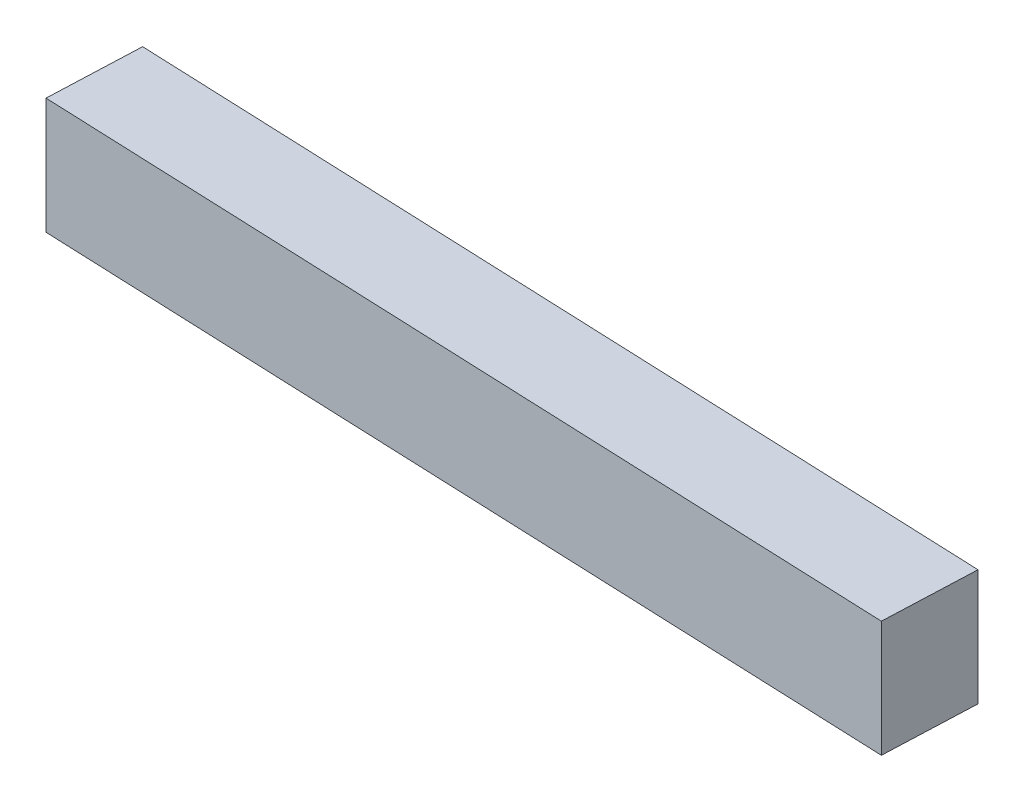
ISO-10303-21;
HEADER;
FILE_DESCRIPTION(('STEP AP214'),'2;1');
FILE_NAME('part.step','',(''),(''),'','','');
FILE_SCHEMA(('AUTOMOTIVE_DESIGN { 1 0 10303 214 1 1 1 1 }'));
ENDSEC;
DATA;
#1=APPLICATION_CONTEXT('core data for automotive mechanical design processes');
#2=APPLICATION_PROTOCOL_DEFINITION('international standard','automotive_design',2000,#1);
#3=PRODUCT_CONTEXT('',#1,'mechanical');
#4=PRODUCT('Part','Part','',(#3));
#5=PRODUCT_RELATED_PRODUCT_CATEGORY('part','',(#4));
#6=PRODUCT_DEFINITION_FORMATION('','',#4);
#7=PRODUCT_DEFINITION_CONTEXT('part definition',#1,'design');
#8=PRODUCT_DEFINITION('design','',#6,#7);
#9=PRODUCT_DEFINITION_SHAPE('','',#8);
#10=(LENGTH_UNIT() NAMED_UNIT(*) SI_UNIT(.MILLI.,.METRE.));
#11=(NAMED_UNIT(*) PLANE_ANGLE_UNIT() SI_UNIT($,.RADIAN.));
#12=(NAMED_UNIT(*) SI_UNIT($,.STERADIAN.) SOLID_ANGLE_UNIT());
#13=UNCERTAINTY_MEASURE_WITH_UNIT(LENGTH_MEASURE(1.E-05),#10,'distance_accuracy_value','');
#14=(GEOMETRIC_REPRESENTATION_CONTEXT(3) GLOBAL_UNCERTAINTY_ASSIGNED_CONTEXT((#13)) GLOBAL_UNIT_ASSIGNED_CONTEXT((#10,
#11,#12)) REPRESENTATION_CONTEXT('',''));
#15=CARTESIAN_POINT('',(0.,0.,0.));
#16=DIRECTION('',(0.,0.,1.));
#17=DIRECTION('',(1.,0.,0.));
#18=AXIS2_PLACEMENT_3D('',#15,#16,#17);
#19=CARTESIAN_POINT('',(17.987452214843,7.874,0.62875382098005));
#20=DIRECTION('',(-0.040515452667737,0.,0.999178911954775));
#21=DIRECTION('',(0.999178911954775,0.,0.040515452667737));
#22=AXIS2_PLACEMENT_3D('',#19,#20,#21);
#23=PLANE('',#22);
#24=DIRECTION('',(0.,1.,0.));
#25=VECTOR('',#24,1.);
#26=CARTESIAN_POINT('',(17.987452214843,7.874,0.62875382098005));
#27=LINE('',#26,#25);
#28=CARTESIAN_POINT('',(17.987452214843,7.62,0.62875382098005));
#29=VERTEX_POINT('',#28);
#30=CARTESIAN_POINT('',(17.987452214843,7.874,0.62875382098005));
#31=VERTEX_POINT('',#30);
#32=EDGE_CURVE('E20',#29,#31,#27,.T.);
#33=ORIENTED_EDGE('',*,*,#32,.T.);
#34=DIRECTION('',(-0.999178911954775,0.,-0.0405154526677359));
#35=VECTOR('',#34,1.);
#36=CARTESIAN_POINT('',(19.8908880421169,7.874,0.705935758312089));
#37=LINE('',#36,#35);
#38=CARTESIAN_POINT('',(19.8908880421169,7.874,0.705935758312089));
#39=VERTEX_POINT('',#38);
#40=EDGE_CURVE('E55',#39,#31,#37,.T.);
#41=ORIENTED_EDGE('',*,*,#40,.F.);
#42=DIRECTION('',(0.,1.,0.));
#43=VECTOR('',#42,1.);
#44=CARTESIAN_POINT('',(19.8908880421169,7.874,0.705935758312089));
#45=LINE('',#44,#43);
#46=CARTESIAN_POINT('',(19.8908880421169,7.62,0.70593575831209));
#47=VERTEX_POINT('',#46);
#48=EDGE_CURVE('E76',#39,#47,#45,.F.);
#49=ORIENTED_EDGE('',*,*,#48,.T.);
#50=DIRECTION('',(-0.999178911954775,0.,-0.0405154526677359));
#51=VECTOR('',#50,1.);
#52=CARTESIAN_POINT('',(19.8908880421169,7.62,0.705935758312089));
#53=LINE('',#52,#51);
#54=EDGE_CURVE('E58',#47,#29,#53,.T.);
#55=ORIENTED_EDGE('',*,*,#54,.T.);
#56=EDGE_LOOP('',(#33,#41,#49,#55));
#57=FACE_BOUND('',#56,.T.);
#58=ADVANCED_FACE('F17',(#57),#23,.F.);
#59=CARTESIAN_POINT('',(17.987452214843,7.874,0.62875382098005));
#60=DIRECTION('',(0.999178911954776,0.,0.0405154526677127));
#61=DIRECTION('',(0.0405154526677127,0.,-0.999178911954776));
#62=AXIS2_PLACEMENT_3D('',#59,#60,#61);
#63=PLANE('',#62);
#64=DIRECTION('',(0.,1.,0.));
#65=VECTOR('',#64,1.);
#66=CARTESIAN_POINT('',(17.9792194748609,7.874,0.831786975889266));
#67=LINE('',#66,#65);
#68=CARTESIAN_POINT('',(17.9792194748609,7.62,0.831786975889266));
#69=VERTEX_POINT('',#68);
#70=CARTESIAN_POINT('',(17.9792194748609,7.874,0.831786975889266));
#71=VERTEX_POINT('',#70);
#72=EDGE_CURVE('E73',#69,#71,#67,.T.);
#73=ORIENTED_EDGE('',*,*,#72,.T.);
#74=DIRECTION('',(-0.040515452667798,0.,0.999178911954773));
#75=VECTOR('',#74,1.);
#76=CARTESIAN_POINT('',(17.987452214843,7.874,0.62875382098005));
#77=LINE('',#76,#75);
#78=EDGE_CURVE('E63',#31,#71,#77,.T.);
#79=ORIENTED_EDGE('',*,*,#78,.F.);
#80=ORIENTED_EDGE('',*,*,#32,.F.);
#81=DIRECTION('',(-0.040515452667798,0.,0.999178911954773));
#82=VECTOR('',#81,1.);
#83=CARTESIAN_POINT('',(17.987452214843,7.62,0.62875382098005));
#84=LINE('',#83,#82);
#85=EDGE_CURVE('E80',#29,#69,#84,.T.);
#86=ORIENTED_EDGE('',*,*,#85,.T.);
#87=EDGE_LOOP('',(#73,#79,#80,#86));
#88=FACE_BOUND('',#87,.T.);
#89=ADVANCED_FACE('F72',(#88),#63,.F.);
#90=CARTESIAN_POINT('',(17.9792194748609,7.874,0.831786975889266));
#91=DIRECTION('',(0.,1.,0.));
#92=DIRECTION('',(0.,0.,1.));
#93=AXIS2_PLACEMENT_3D('',#90,#91,#92);
#94=PLANE('',#93);
#95=DIRECTION('',(-0.0405154511466888,0.,0.999178912016452));
#96=VECTOR('',#95,1.);
#97=CARTESIAN_POINT('',(19.8908880421169,7.874,0.705935758312089));
#98=LINE('',#97,#96);
#99=CARTESIAN_POINT('',(19.8826553024438,7.874,0.908968913233835));
#100=VERTEX_POINT('',#99);
#101=EDGE_CURVE('E69',#100,#39,#98,.F.);
#102=ORIENTED_EDGE('',*,*,#101,.T.);
#103=ORIENTED_EDGE('',*,*,#40,.T.);
#104=ORIENTED_EDGE('',*,*,#78,.T.);
#105=DIRECTION('',(-0.999178911954775,0.,-0.0405154526677348));
#106=VECTOR('',#105,1.);
#107=CARTESIAN_POINT('',(17.9792194748609,7.874,0.831786975889266));
#108=LINE('',#107,#106);
#109=EDGE_CURVE('E83',#71,#100,#108,.F.);
#110=ORIENTED_EDGE('',*,*,#109,.T.);
#111=EDGE_LOOP('',(#102,#103,#104,#110));
#112=FACE_BOUND('',#111,.T.);
#113=ADVANCED_FACE('F66',(#112),#94,.T.);
#114=CARTESIAN_POINT('',(19.8908880421169,7.874,0.705935758312089));
#115=DIRECTION('',(-0.999178912016452,0.,-0.0405154511466888));
#116=DIRECTION('',(-0.0405154511466888,0.,0.999178912016452));
#117=AXIS2_PLACEMENT_3D('',#114,#115,#116);
#118=PLANE('',#117);
#119=ORIENTED_EDGE('',*,*,#48,.F.);
#120=ORIENTED_EDGE('',*,*,#101,.F.);
#121=DIRECTION('',(0.,1.,0.));
#122=VECTOR('',#121,1.);
#123=CARTESIAN_POINT('',(19.8826553024438,7.874,0.908968913233833));
#124=LINE('',#123,#122);
#125=CARTESIAN_POINT('',(19.8826553024438,7.62,0.908968913233836));
#126=VERTEX_POINT('',#125);
#127=EDGE_CURVE('E26',#100,#126,#124,.F.);
#128=ORIENTED_EDGE('',*,*,#127,.T.);
#129=DIRECTION('',(0.040515451147132,0.,-0.999178912016434));
#130=VECTOR('',#129,1.);
#131=CARTESIAN_POINT('',(19.8826553024438,7.62,0.908968913233834));
#132=LINE('',#131,#130);
#133=EDGE_CURVE('E34',#126,#47,#132,.T.);
#134=ORIENTED_EDGE('',*,*,#133,.T.);
#135=EDGE_LOOP('',(#119,#120,#128,#134));
#136=FACE_BOUND('',#135,.T.);
#137=ADVANCED_FACE('F88',(#136),#118,.F.);
#138=CARTESIAN_POINT('',(17.9792194748609,7.62,0.831786975889266));
#139=DIRECTION('',(0.,1.,0.));
#140=DIRECTION('',(0.,0.,1.));
#141=AXIS2_PLACEMENT_3D('',#138,#139,#140);
#142=PLANE('',#141);
#143=ORIENTED_EDGE('',*,*,#54,.F.);
#144=ORIENTED_EDGE('',*,*,#133,.F.);
#145=DIRECTION('',(-0.999178911954775,0.,-0.0405154526677348));
#146=VECTOR('',#145,1.);
#147=CARTESIAN_POINT('',(17.9792194748609,7.62,0.831786975889266));
#148=LINE('',#147,#146);
#149=EDGE_CURVE('E11',#126,#69,#148,.T.);
#150=ORIENTED_EDGE('',*,*,#149,.T.);
#151=ORIENTED_EDGE('',*,*,#85,.F.);
#152=EDGE_LOOP('',(#143,#144,#150,#151));
#153=FACE_BOUND('',#152,.T.);
#154=ADVANCED_FACE('F91',(#153),#142,.F.);
#155=CARTESIAN_POINT('',(17.9792194748609,7.874,0.831786975889266));
#156=DIRECTION('',(0.0405154526677348,0.,-0.999178911954775));
#157=DIRECTION('',(-0.999178911954775,0.,-0.0405154526677348));
#158=AXIS2_PLACEMENT_3D('',#155,#156,#157);
#159=PLANE('',#158);
#160=ORIENTED_EDGE('',*,*,#127,.F.);
#161=ORIENTED_EDGE('',*,*,#109,.F.);
#162=ORIENTED_EDGE('',*,*,#72,.F.);
#163=ORIENTED_EDGE('',*,*,#149,.F.);
#164=EDGE_LOOP('',(#160,#161,#162,#163));
#165=FACE_BOUND('',#164,.T.);
#166=ADVANCED_FACE('F90',(#165),#159,.F.);
#167=CLOSED_SHELL('',(#58,#89,#113,#137,#154,#166));
#168=MANIFOLD_SOLID_BREP('B1',#167);
#169=ADVANCED_BREP_SHAPE_REPRESENTATION('',(#18,#168),#14);
#170=SHAPE_DEFINITION_REPRESENTATION(#9,#169);
ENDSEC;
END-ISO-10303-21;
